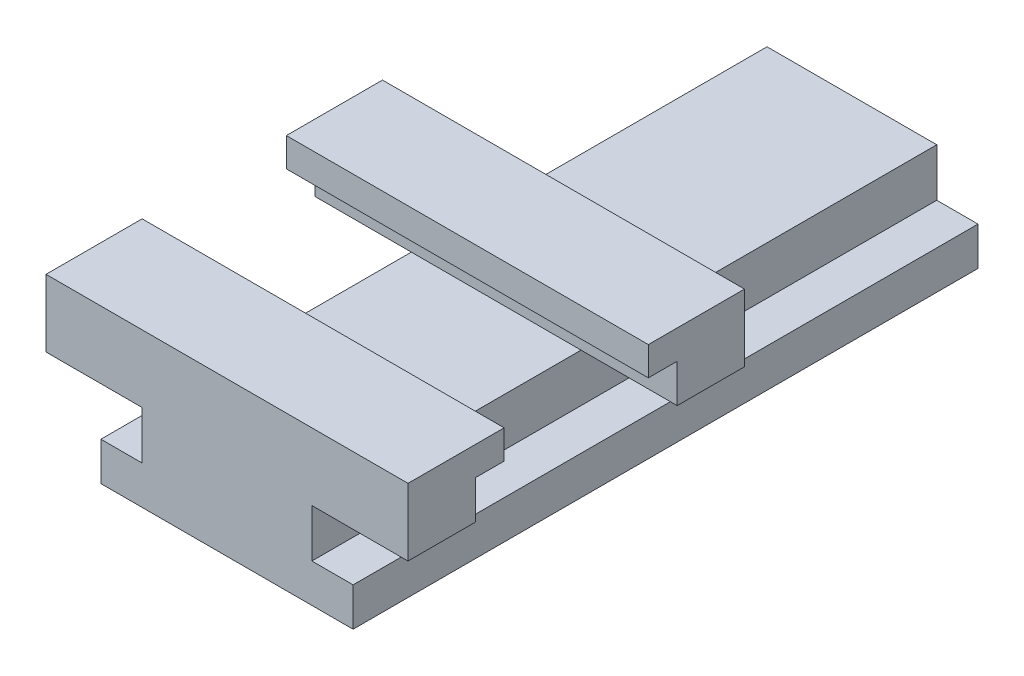
ISO-10303-21;
HEADER;
FILE_DESCRIPTION(('STEP AP214'),'2;1');
FILE_NAME('part.step','',(''),(''),'','','');
FILE_SCHEMA(('AUTOMOTIVE_DESIGN { 1 0 10303 214 1 1 1 1 }'));
ENDSEC;
DATA;
#1=APPLICATION_CONTEXT('core data for automotive mechanical design processes');
#2=APPLICATION_PROTOCOL_DEFINITION('international standard','automotive_design',2000,#1);
#3=PRODUCT_CONTEXT('',#1,'mechanical');
#4=PRODUCT('Part','Part','',(#3));
#5=PRODUCT_RELATED_PRODUCT_CATEGORY('part','',(#4));
#6=PRODUCT_DEFINITION_FORMATION('','',#4);
#7=PRODUCT_DEFINITION_CONTEXT('part definition',#1,'design');
#8=PRODUCT_DEFINITION('design','',#6,#7);
#9=PRODUCT_DEFINITION_SHAPE('','',#8);
#10=(LENGTH_UNIT() NAMED_UNIT(*) SI_UNIT(.MILLI.,.METRE.));
#11=(NAMED_UNIT(*) PLANE_ANGLE_UNIT() SI_UNIT($,.RADIAN.));
#12=(NAMED_UNIT(*) SI_UNIT($,.STERADIAN.) SOLID_ANGLE_UNIT());
#13=UNCERTAINTY_MEASURE_WITH_UNIT(LENGTH_MEASURE(1.E-05),#10,'distance_accuracy_value','');
#14=(GEOMETRIC_REPRESENTATION_CONTEXT(3) GLOBAL_UNCERTAINTY_ASSIGNED_CONTEXT((#13)) GLOBAL_UNIT_ASSIGNED_CONTEXT((#10,
#11,#12)) REPRESENTATION_CONTEXT('',''));
#15=CARTESIAN_POINT('',(0.,0.,0.));
#16=DIRECTION('',(0.,0.,1.));
#17=DIRECTION('',(1.,0.,0.));
#18=AXIS2_PLACEMENT_3D('',#15,#16,#17);
#19=CARTESIAN_POINT('',(0.,0.,0.));
#20=DIRECTION('',(0.,0.,1.));
#21=DIRECTION('',(1.,0.,0.));
#22=AXIS2_PLACEMENT_3D('',#19,#20,#21);
#23=PLANE('',#22);
#24=DIRECTION('',(-1.,0.,0.));
#25=VECTOR('',#24,1.);
#26=CARTESIAN_POINT('',(0.,2.,0.));
#27=LINE('',#26,#25);
#28=CARTESIAN_POINT('',(17.6562351707865,2.,0.));
#29=VERTEX_POINT('',#28);
#30=CARTESIAN_POINT('',(-17.6562351707865,2.,0.));
#31=VERTEX_POINT('',#30);
#32=EDGE_CURVE('E234',#29,#31,#27,.T.);
#33=ORIENTED_EDGE('',*,*,#32,.F.);
#34=DIRECTION('',(0.,-1.,0.));
#35=VECTOR('',#34,1.);
#36=CARTESIAN_POINT('',(17.6562351707865,0.,0.));
#37=LINE('',#36,#35);
#38=CARTESIAN_POINT('',(17.6562351707865,-8.,0.));
#39=VERTEX_POINT('',#38);
#40=EDGE_CURVE('E180',#29,#39,#37,.T.);
#41=ORIENTED_EDGE('',*,*,#40,.T.);
#42=DIRECTION('',(1.,0.,0.));
#43=VECTOR('',#42,1.);
#44=CARTESIAN_POINT('',(0.,-8.,0.));
#45=LINE('',#44,#43);
#46=CARTESIAN_POINT('',(26.23674746176,-8.,0.));
#47=VERTEX_POINT('',#46);
#48=EDGE_CURVE('E176',#39,#47,#45,.T.);
#49=ORIENTED_EDGE('',*,*,#48,.T.);
#50=DIRECTION('',(0.,-1.,0.));
#51=VECTOR('',#50,1.);
#52=CARTESIAN_POINT('',(26.23674746176,0.,0.));
#53=LINE('',#52,#51);
#54=CARTESIAN_POINT('',(26.23674746176,-16.,0.));
#55=VERTEX_POINT('',#54);
#56=EDGE_CURVE('E171',#47,#55,#53,.T.);
#57=ORIENTED_EDGE('',*,*,#56,.T.);
#58=DIRECTION('',(1.,0.,0.));
#59=VECTOR('',#58,1.);
#60=CARTESIAN_POINT('',(0.,-16.,0.));
#61=LINE('',#60,#59);
#62=CARTESIAN_POINT('',(-26.23674746176,-16.,0.));
#63=VERTEX_POINT('',#62);
#64=EDGE_CURVE('E167',#63,#55,#61,.T.);
#65=ORIENTED_EDGE('',*,*,#64,.F.);
#66=DIRECTION('',(0.,-1.,0.));
#67=VECTOR('',#66,1.);
#68=CARTESIAN_POINT('',(-26.23674746176,0.,0.));
#69=LINE('',#68,#67);
#70=CARTESIAN_POINT('',(-26.23674746176,-8.,0.));
#71=VERTEX_POINT('',#70);
#72=EDGE_CURVE('E99',#71,#63,#69,.T.);
#73=ORIENTED_EDGE('',*,*,#72,.F.);
#74=DIRECTION('',(-1.,0.,0.));
#75=VECTOR('',#74,1.);
#76=CARTESIAN_POINT('',(0.,-8.,0.));
#77=LINE('',#76,#75);
#78=CARTESIAN_POINT('',(-17.6562351707865,-8.,0.));
#79=VERTEX_POINT('',#78);
#80=EDGE_CURVE('E186',#79,#71,#77,.T.);
#81=ORIENTED_EDGE('',*,*,#80,.F.);
#82=DIRECTION('',(0.,-1.,0.));
#83=VECTOR('',#82,1.);
#84=CARTESIAN_POINT('',(-17.6562351707865,0.,0.));
#85=LINE('',#84,#83);
#86=EDGE_CURVE('E152',#31,#79,#85,.T.);
#87=ORIENTED_EDGE('',*,*,#86,.F.);
#88=EDGE_LOOP('',(#33,#41,#49,#57,#65,#73,#81,#87));
#89=FACE_BOUND('',#88,.T.);
#90=ADVANCED_FACE('F44',(#89),#23,.F.);
#91=CARTESIAN_POINT('',(0.,2.,130.));
#92=DIRECTION('',(0.,-1.,0.));
#93=DIRECTION('',(0.,0.,-1.));
#94=AXIS2_PLACEMENT_3D('',#91,#92,#93);
#95=PLANE('',#94);
#96=DIRECTION('',(-1.,0.,0.));
#97=VECTOR('',#96,1.);
#98=CARTESIAN_POINT('',(56.3437648292135,2.,116.));
#99=LINE('',#98,#97);
#100=CARTESIAN_POINT('',(37.6562351707865,2.,116.));
#101=VERTEX_POINT('',#100);
#102=CARTESIAN_POINT('',(17.6562351707865,2.,116.));
#103=VERTEX_POINT('',#102);
#104=EDGE_CURVE('E450',#101,#103,#99,.T.);
#105=ORIENTED_EDGE('',*,*,#104,.F.);
#106=DIRECTION('',(0.,0.,-1.));
#107=VECTOR('',#106,1.);
#108=CARTESIAN_POINT('',(37.6562351707865,2.,130.));
#109=LINE('',#108,#107);
#110=CARTESIAN_POINT('',(37.6562351707865,2.,130.));
#111=VERTEX_POINT('',#110);
#112=EDGE_CURVE('E215',#111,#101,#109,.T.);
#113=ORIENTED_EDGE('',*,*,#112,.F.);
#114=DIRECTION('',(-1.,0.,0.));
#115=VECTOR('',#114,1.);
#116=CARTESIAN_POINT('',(0.,2.,130.));
#117=LINE('',#116,#115);
#118=CARTESIAN_POINT('',(17.6562351707865,2.,130.));
#119=VERTEX_POINT('',#118);
#120=EDGE_CURVE('E296',#111,#119,#117,.T.);
#121=ORIENTED_EDGE('',*,*,#120,.T.);
#122=DIRECTION('',(0.,0.,-1.));
#123=VECTOR('',#122,1.);
#124=CARTESIAN_POINT('',(17.6562351707865,2.,130.));
#125=LINE('',#124,#123);
#126=EDGE_CURVE('E220',#119,#103,#125,.T.);
#127=ORIENTED_EDGE('',*,*,#126,.T.);
#128=EDGE_LOOP('',(#105,#113,#121,#127));
#129=FACE_BOUND('',#128,.T.);
#130=ADVANCED_FACE('F473',(#129),#95,.T.);
#131=DIRECTION('',(-1.,0.,0.));
#132=VECTOR('',#131,1.);
#133=CARTESIAN_POINT('',(56.3437648292135,2.,74.));
#134=LINE('',#133,#132);
#135=CARTESIAN_POINT('',(37.6562351707865,2.,74.));
#136=VERTEX_POINT('',#135);
#137=CARTESIAN_POINT('',(17.6562351707865,2.,74.));
#138=VERTEX_POINT('',#137);
#139=EDGE_CURVE('E428',#136,#138,#134,.T.);
#140=ORIENTED_EDGE('',*,*,#139,.T.);
#141=CARTESIAN_POINT('',(17.6562351707865,2.,60.));
#142=VERTEX_POINT('',#141);
#143=EDGE_CURVE('E219',#138,#142,#125,.T.);
#144=ORIENTED_EDGE('',*,*,#143,.T.);
#145=DIRECTION('',(1.,0.,0.));
#146=VECTOR('',#145,1.);
#147=CARTESIAN_POINT('',(0.,2.,60.));
#148=LINE('',#147,#146);
#149=CARTESIAN_POINT('',(37.6562351707865,2.,60.));
#150=VERTEX_POINT('',#149);
#151=EDGE_CURVE('E418',#142,#150,#148,.T.);
#152=ORIENTED_EDGE('',*,*,#151,.T.);
#153=EDGE_CURVE('E214',#136,#150,#109,.T.);
#154=ORIENTED_EDGE('',*,*,#153,.F.);
#155=EDGE_LOOP('',(#140,#144,#152,#154));
#156=FACE_BOUND('',#155,.T.);
#157=ADVANCED_FACE('F514',(#156),#95,.T.);
#158=CARTESIAN_POINT('',(37.6562351707865,0.,130.));
#159=DIRECTION('',(1.,0.,0.));
#160=DIRECTION('',(0.,0.,-1.));
#161=AXIS2_PLACEMENT_3D('',#158,#159,#160);
#162=PLANE('',#161);
#163=DIRECTION('',(0.,0.,1.));
#164=VECTOR('',#163,1.);
#165=CARTESIAN_POINT('',(37.6562351707865,10.,130.));
#166=LINE('',#165,#164);
#167=CARTESIAN_POINT('',(37.6562351707865,10.,110.));
#168=VERTEX_POINT('',#167);
#169=CARTESIAN_POINT('',(37.6562351707865,10.,116.));
#170=VERTEX_POINT('',#169);
#171=EDGE_CURVE('E442',#168,#170,#166,.T.);
#172=ORIENTED_EDGE('',*,*,#171,.F.);
#173=DIRECTION('',(0.,1.,0.));
#174=VECTOR('',#173,1.);
#175=CARTESIAN_POINT('',(37.6562351707865,2.,110.));
#176=LINE('',#175,#174);
#177=CARTESIAN_POINT('',(37.6562351707865,16.,110.));
#178=VERTEX_POINT('',#177);
#179=EDGE_CURVE('E275',#168,#178,#176,.T.);
#180=ORIENTED_EDGE('',*,*,#179,.T.);
#181=DIRECTION('',(0.,0.,-1.));
#182=VECTOR('',#181,1.);
#183=CARTESIAN_POINT('',(37.6562351707865,16.,130.));
#184=LINE('',#183,#182);
#185=CARTESIAN_POINT('',(37.6562351707865,16.,130.));
#186=VERTEX_POINT('',#185);
#187=EDGE_CURVE('E210',#186,#178,#184,.T.);
#188=ORIENTED_EDGE('',*,*,#187,.F.);
#189=DIRECTION('',(0.,-1.,0.));
#190=VECTOR('',#189,1.);
#191=CARTESIAN_POINT('',(37.6562351707865,0.,130.));
#192=LINE('',#191,#190);
#193=EDGE_CURVE('E300',#186,#111,#192,.T.);
#194=ORIENTED_EDGE('',*,*,#193,.T.);
#195=ORIENTED_EDGE('',*,*,#112,.T.);
#196=DIRECTION('',(0.,-1.,0.));
#197=VECTOR('',#196,1.);
#198=CARTESIAN_POINT('',(37.6562351707865,0.,116.));
#199=LINE('',#198,#197);
#200=EDGE_CURVE('E262',#170,#101,#199,.T.);
#201=ORIENTED_EDGE('',*,*,#200,.F.);
#202=EDGE_LOOP('',(#172,#180,#188,#194,#195,#201));
#203=FACE_BOUND('',#202,.T.);
#204=ADVANCED_FACE('F476',(#203),#162,.T.);
#205=DIRECTION('',(0.,1.,0.));
#206=VECTOR('',#205,1.);
#207=CARTESIAN_POINT('',(37.6562351707865,0.,74.));
#208=LINE('',#207,#206);
#209=CARTESIAN_POINT('',(37.6562351707865,10.,74.));
#210=VERTEX_POINT('',#209);
#211=EDGE_CURVE('E419',#136,#210,#208,.T.);
#212=ORIENTED_EDGE('',*,*,#211,.F.);
#213=ORIENTED_EDGE('',*,*,#153,.T.);
#214=DIRECTION('',(0.,1.,0.));
#215=VECTOR('',#214,1.);
#216=CARTESIAN_POINT('',(37.6562351707865,2.,60.));
#217=LINE('',#216,#215);
#218=CARTESIAN_POINT('',(37.6562351707865,16.,60.));
#219=VERTEX_POINT('',#218);
#220=EDGE_CURVE('E407',#150,#219,#217,.T.);
#221=ORIENTED_EDGE('',*,*,#220,.T.);
#222=CARTESIAN_POINT('',(37.6562351707865,16.,80.));
#223=VERTEX_POINT('',#222);
#224=EDGE_CURVE('E209',#223,#219,#184,.T.);
#225=ORIENTED_EDGE('',*,*,#224,.F.);
#226=DIRECTION('',(0.,1.,0.));
#227=VECTOR('',#226,1.);
#228=CARTESIAN_POINT('',(37.6562351707865,2.,80.));
#229=LINE('',#228,#227);
#230=CARTESIAN_POINT('',(37.6562351707865,10.,80.));
#231=VERTEX_POINT('',#230);
#232=EDGE_CURVE('E269',#231,#223,#229,.T.);
#233=ORIENTED_EDGE('',*,*,#232,.F.);
#234=DIRECTION('',(0.,0.,1.));
#235=VECTOR('',#234,1.);
#236=CARTESIAN_POINT('',(37.6562351707865,10.,130.));
#237=LINE('',#236,#235);
#238=EDGE_CURVE('E60',#210,#231,#237,.T.);
#239=ORIENTED_EDGE('',*,*,#238,.F.);
#240=EDGE_LOOP('',(#212,#213,#221,#225,#233,#239));
#241=FACE_BOUND('',#240,.T.);
#242=ADVANCED_FACE('F522',(#241),#162,.T.);
#243=CARTESIAN_POINT('',(0.,16.,130.));
#244=DIRECTION('',(0.,-1.,0.));
#245=DIRECTION('',(0.,0.,-1.));
#246=AXIS2_PLACEMENT_3D('',#243,#244,#245);
#247=PLANE('',#246);
#248=DIRECTION('',(-1.,0.,0.));
#249=VECTOR('',#248,1.);
#250=CARTESIAN_POINT('',(0.,16.,110.));
#251=LINE('',#250,#249);
#252=CARTESIAN_POINT('',(-37.6562351707865,16.,110.));
#253=VERTEX_POINT('',#252);
#254=EDGE_CURVE('E391',#178,#253,#251,.T.);
#255=ORIENTED_EDGE('',*,*,#254,.T.);
#256=DIRECTION('',(0.,0.,-1.));
#257=VECTOR('',#256,1.);
#258=CARTESIAN_POINT('',(-37.6562351707865,16.,130.));
#259=LINE('',#258,#257);
#260=CARTESIAN_POINT('',(-37.6562351707865,16.,130.));
#261=VERTEX_POINT('',#260);
#262=EDGE_CURVE('E205',#261,#253,#259,.T.);
#263=ORIENTED_EDGE('',*,*,#262,.F.);
#264=DIRECTION('',(-1.,0.,0.));
#265=VECTOR('',#264,1.);
#266=CARTESIAN_POINT('',(0.,16.,130.));
#267=LINE('',#266,#265);
#268=EDGE_CURVE('E304',#186,#261,#267,.T.);
#269=ORIENTED_EDGE('',*,*,#268,.F.);
#270=ORIENTED_EDGE('',*,*,#187,.T.);
#271=EDGE_LOOP('',(#255,#263,#269,#270));
#272=FACE_BOUND('',#271,.T.);
#273=ADVANCED_FACE('F394',(#272),#247,.F.);
#274=ORIENTED_EDGE('',*,*,#224,.T.);
#275=DIRECTION('',(1.,0.,0.));
#276=VECTOR('',#275,1.);
#277=CARTESIAN_POINT('',(0.,16.,60.));
#278=LINE('',#277,#276);
#279=CARTESIAN_POINT('',(-37.6562351707865,16.,60.));
#280=VERTEX_POINT('',#279);
#281=EDGE_CURVE('E415',#280,#219,#278,.T.);
#282=ORIENTED_EDGE('',*,*,#281,.F.);
#283=CARTESIAN_POINT('',(-37.6562351707865,16.,80.));
#284=VERTEX_POINT('',#283);
#285=EDGE_CURVE('E204',#284,#280,#259,.T.);
#286=ORIENTED_EDGE('',*,*,#285,.F.);
#287=DIRECTION('',(1.,0.,0.));
#288=VECTOR('',#287,1.);
#289=CARTESIAN_POINT('',(0.,16.,80.));
#290=LINE('',#289,#288);
#291=EDGE_CURVE('E266',#284,#223,#290,.T.);
#292=ORIENTED_EDGE('',*,*,#291,.T.);
#293=EDGE_LOOP('',(#274,#282,#286,#292));
#294=FACE_BOUND('',#293,.T.);
#295=ADVANCED_FACE('F524',(#294),#247,.F.);
#296=CARTESIAN_POINT('',(-37.6562351707865,0.,130.));
#297=DIRECTION('',(1.,0.,0.));
#298=DIRECTION('',(0.,0.,-1.));
#299=AXIS2_PLACEMENT_3D('',#296,#297,#298);
#300=PLANE('',#299);
#301=DIRECTION('',(0.,1.,0.));
#302=VECTOR('',#301,1.);
#303=CARTESIAN_POINT('',(-37.6562351707865,2.,110.));
#304=LINE('',#303,#302);
#305=CARTESIAN_POINT('',(-37.6562351707865,10.,110.));
#306=VERTEX_POINT('',#305);
#307=EDGE_CURVE('E172',#306,#253,#304,.T.);
#308=ORIENTED_EDGE('',*,*,#307,.F.);
#309=DIRECTION('',(0.,0.,-1.));
#310=VECTOR('',#309,1.);
#311=CARTESIAN_POINT('',(-37.6562351707865,10.,116.));
#312=LINE('',#311,#310);
#313=CARTESIAN_POINT('',(-37.6562351707865,10.,116.));
#314=VERTEX_POINT('',#313);
#315=EDGE_CURVE('E449',#314,#306,#312,.T.);
#316=ORIENTED_EDGE('',*,*,#315,.F.);
#317=DIRECTION('',(0.,1.,0.));
#318=VECTOR('',#317,1.);
#319=CARTESIAN_POINT('',(-37.6562351707865,2.,116.));
#320=LINE('',#319,#318);
#321=CARTESIAN_POINT('',(-37.6562351707865,2.,116.));
#322=VERTEX_POINT('',#321);
#323=EDGE_CURVE('E322',#322,#314,#320,.T.);
#324=ORIENTED_EDGE('',*,*,#323,.F.);
#325=DIRECTION('',(0.,0.,-1.));
#326=VECTOR('',#325,1.);
#327=CARTESIAN_POINT('',(-37.6562351707865,2.,130.));
#328=LINE('',#327,#326);
#329=CARTESIAN_POINT('',(-37.6562351707865,2.,130.));
#330=VERTEX_POINT('',#329);
#331=EDGE_CURVE('E200',#330,#322,#328,.T.);
#332=ORIENTED_EDGE('',*,*,#331,.F.);
#333=DIRECTION('',(0.,-1.,0.));
#334=VECTOR('',#333,1.);
#335=CARTESIAN_POINT('',(-37.6562351707865,0.,130.));
#336=LINE('',#335,#334);
#337=EDGE_CURVE('E307',#261,#330,#336,.T.);
#338=ORIENTED_EDGE('',*,*,#337,.F.);
#339=ORIENTED_EDGE('',*,*,#262,.T.);
#340=EDGE_LOOP('',(#308,#316,#324,#332,#338,#339));
#341=FACE_BOUND('',#340,.T.);
#342=ADVANCED_FACE('F318',(#341),#300,.F.);
#343=CARTESIAN_POINT('',(-37.6562351707865,2.,74.));
#344=VERTEX_POINT('',#343);
#345=CARTESIAN_POINT('',(-37.6562351707865,2.,60.));
#346=VERTEX_POINT('',#345);
#347=EDGE_CURVE('E198',#344,#346,#328,.T.);
#348=ORIENTED_EDGE('',*,*,#347,.F.);
#349=DIRECTION('',(0.,-1.,0.));
#350=VECTOR('',#349,1.);
#351=CARTESIAN_POINT('',(-37.6562351707865,10.,74.));
#352=LINE('',#351,#350);
#353=CARTESIAN_POINT('',(-37.6562351707865,10.,74.));
#354=VERTEX_POINT('',#353);
#355=EDGE_CURVE('E260',#354,#344,#352,.T.);
#356=ORIENTED_EDGE('',*,*,#355,.F.);
#357=DIRECTION('',(0.,0.,-1.));
#358=VECTOR('',#357,1.);
#359=CARTESIAN_POINT('',(-37.6562351707865,10.,80.));
#360=LINE('',#359,#358);
#361=CARTESIAN_POINT('',(-37.6562351707865,10.,80.));
#362=VERTEX_POINT('',#361);
#363=EDGE_CURVE('E243',#362,#354,#360,.T.);
#364=ORIENTED_EDGE('',*,*,#363,.F.);
#365=DIRECTION('',(0.,1.,0.));
#366=VECTOR('',#365,1.);
#367=CARTESIAN_POINT('',(-37.6562351707865,2.,80.));
#368=LINE('',#367,#366);
#369=EDGE_CURVE('E257',#362,#284,#368,.T.);
#370=ORIENTED_EDGE('',*,*,#369,.T.);
#371=ORIENTED_EDGE('',*,*,#285,.T.);
#372=DIRECTION('',(0.,1.,0.));
#373=VECTOR('',#372,1.);
#374=CARTESIAN_POINT('',(-37.6562351707865,2.,60.));
#375=LINE('',#374,#373);
#376=EDGE_CURVE('E408',#346,#280,#375,.T.);
#377=ORIENTED_EDGE('',*,*,#376,.F.);
#378=EDGE_LOOP('',(#348,#356,#364,#370,#371,#377));
#379=FACE_BOUND('',#378,.T.);
#380=ADVANCED_FACE('F254',(#379),#300,.F.);
#381=CARTESIAN_POINT('',(0.,2.,130.));
#382=DIRECTION('',(0.,1.,0.));
#383=DIRECTION('',(0.,0.,1.));
#384=AXIS2_PLACEMENT_3D('',#381,#382,#383);
#385=PLANE('',#384);
#386=ORIENTED_EDGE('',*,*,#331,.T.);
#387=CARTESIAN_POINT('',(-17.6562351707865,2.,116.));
#388=VERTEX_POINT('',#387);
#389=EDGE_CURVE('E328',#388,#322,#99,.T.);
#390=ORIENTED_EDGE('',*,*,#389,.F.);
#391=DIRECTION('',(0.,0.,-1.));
#392=VECTOR('',#391,1.);
#393=CARTESIAN_POINT('',(-17.6562351707865,2.,130.));
#394=LINE('',#393,#392);
#395=CARTESIAN_POINT('',(-17.6562351707865,2.,130.));
#396=VERTEX_POINT('',#395);
#397=EDGE_CURVE('E195',#396,#388,#394,.T.);
#398=ORIENTED_EDGE('',*,*,#397,.F.);
#399=DIRECTION('',(1.,0.,0.));
#400=VECTOR('',#399,1.);
#401=CARTESIAN_POINT('',(0.,2.,130.));
#402=LINE('',#401,#400);
#403=EDGE_CURVE('E141',#330,#396,#402,.T.);
#404=ORIENTED_EDGE('',*,*,#403,.F.);
#405=EDGE_LOOP('',(#386,#390,#398,#404));
#406=FACE_BOUND('',#405,.T.);
#407=ADVANCED_FACE('F325',(#406),#385,.F.);
#408=CARTESIAN_POINT('',(-17.6562351707865,2.,74.));
#409=VERTEX_POINT('',#408);
#410=CARTESIAN_POINT('',(-17.6562351707865,2.,60.));
#411=VERTEX_POINT('',#410);
#412=EDGE_CURVE('E156',#409,#411,#394,.T.);
#413=ORIENTED_EDGE('',*,*,#412,.F.);
#414=EDGE_CURVE('E432',#409,#344,#134,.T.);
#415=ORIENTED_EDGE('',*,*,#414,.T.);
#416=ORIENTED_EDGE('',*,*,#347,.T.);
#417=EDGE_CURVE('E411',#346,#411,#148,.T.);
#418=ORIENTED_EDGE('',*,*,#417,.T.);
#419=EDGE_LOOP('',(#413,#415,#416,#418));
#420=FACE_BOUND('',#419,.T.);
#421=ADVANCED_FACE('F526',(#420),#385,.F.);
#422=CARTESIAN_POINT('',(0.,-16.,130.));
#423=DIRECTION('',(0.,1.,0.));
#424=DIRECTION('',(0.,0.,1.));
#425=AXIS2_PLACEMENT_3D('',#422,#423,#424);
#426=PLANE('',#425);
#427=ORIENTED_EDGE('',*,*,#64,.T.);
#428=DIRECTION('',(0.,0.,-1.));
#429=VECTOR('',#428,1.);
#430=CARTESIAN_POINT('',(26.23674746176,-16.,130.));
#431=LINE('',#430,#429);
#432=CARTESIAN_POINT('',(26.23674746176,-16.,130.));
#433=VERTEX_POINT('',#432);
#434=EDGE_CURVE('E231',#433,#55,#431,.T.);
#435=ORIENTED_EDGE('',*,*,#434,.F.);
#436=DIRECTION('',(1.,0.,0.));
#437=VECTOR('',#436,1.);
#438=CARTESIAN_POINT('',(0.,-16.,130.));
#439=LINE('',#438,#437);
#440=CARTESIAN_POINT('',(-26.23674746176,-16.,130.));
#441=VERTEX_POINT('',#440);
#442=EDGE_CURVE('E105',#441,#433,#439,.T.);
#443=ORIENTED_EDGE('',*,*,#442,.F.);
#444=DIRECTION('',(0.,0.,-1.));
#445=VECTOR('',#444,1.);
#446=CARTESIAN_POINT('',(-26.23674746176,-16.,130.));
#447=LINE('',#446,#445);
#448=EDGE_CURVE('E163',#441,#63,#447,.T.);
#449=ORIENTED_EDGE('',*,*,#448,.T.);
#450=EDGE_LOOP('',(#427,#435,#443,#449));
#451=FACE_BOUND('',#450,.T.);
#452=ADVANCED_FACE('F46',(#451),#426,.F.);
#453=CARTESIAN_POINT('',(26.23674746176,0.,130.));
#454=DIRECTION('',(1.,0.,0.));
#455=DIRECTION('',(0.,1.,0.));
#456=AXIS2_PLACEMENT_3D('',#453,#454,#455);
#457=PLANE('',#456);
#458=ORIENTED_EDGE('',*,*,#56,.F.);
#459=DIRECTION('',(0.,0.,-1.));
#460=VECTOR('',#459,1.);
#461=CARTESIAN_POINT('',(26.23674746176,-8.,130.));
#462=LINE('',#461,#460);
#463=CARTESIAN_POINT('',(26.23674746176,-8.,130.));
#464=VERTEX_POINT('',#463);
#465=EDGE_CURVE('E228',#464,#47,#462,.T.);
#466=ORIENTED_EDGE('',*,*,#465,.F.);
#467=DIRECTION('',(0.,-1.,0.));
#468=VECTOR('',#467,1.);
#469=CARTESIAN_POINT('',(26.23674746176,0.,130.));
#470=LINE('',#469,#468);
#471=EDGE_CURVE('E284',#464,#433,#470,.T.);
#472=ORIENTED_EDGE('',*,*,#471,.T.);
#473=ORIENTED_EDGE('',*,*,#434,.T.);
#474=EDGE_LOOP('',(#458,#466,#472,#473));
#475=FACE_BOUND('',#474,.T.);
#476=ADVANCED_FACE('F567',(#475),#457,.T.);
#477=CARTESIAN_POINT('',(0.,-8.,130.));
#478=DIRECTION('',(0.,1.,0.));
#479=DIRECTION('',(0.,0.,1.));
#480=AXIS2_PLACEMENT_3D('',#477,#478,#479);
#481=PLANE('',#480);
#482=ORIENTED_EDGE('',*,*,#48,.F.);
#483=DIRECTION('',(0.,0.,-1.));
#484=VECTOR('',#483,1.);
#485=CARTESIAN_POINT('',(17.6562351707865,-8.,130.));
#486=LINE('',#485,#484);
#487=CARTESIAN_POINT('',(17.6562351707865,-8.,130.));
#488=VERTEX_POINT('',#487);
#489=EDGE_CURVE('E224',#488,#39,#486,.T.);
#490=ORIENTED_EDGE('',*,*,#489,.F.);
#491=DIRECTION('',(1.,0.,0.));
#492=VECTOR('',#491,1.);
#493=CARTESIAN_POINT('',(0.,-8.,130.));
#494=LINE('',#493,#492);
#495=EDGE_CURVE('E288',#488,#464,#494,.T.);
#496=ORIENTED_EDGE('',*,*,#495,.T.);
#497=ORIENTED_EDGE('',*,*,#465,.T.);
#498=EDGE_LOOP('',(#482,#490,#496,#497));
#499=FACE_BOUND('',#498,.T.);
#500=ADVANCED_FACE('F565',(#499),#481,.T.);
#501=CARTESIAN_POINT('',(17.6562351707865,0.,130.));
#502=DIRECTION('',(1.,0.,0.));
#503=DIRECTION('',(0.,0.,-1.));
#504=AXIS2_PLACEMENT_3D('',#501,#502,#503);
#505=PLANE('',#504);
#506=ORIENTED_EDGE('',*,*,#40,.F.);
#507=DIRECTION('',(0.,0.,1.));
#508=VECTOR('',#507,1.);
#509=CARTESIAN_POINT('',(17.6562351707865,2.,130.));
#510=LINE('',#509,#508);
#511=EDGE_CURVE('E396',#29,#142,#510,.T.);
#512=ORIENTED_EDGE('',*,*,#511,.T.);
#513=ORIENTED_EDGE('',*,*,#143,.F.);
#514=EDGE_CURVE('E225',#103,#138,#125,.T.);
#515=ORIENTED_EDGE('',*,*,#514,.F.);
#516=ORIENTED_EDGE('',*,*,#126,.F.);
#517=DIRECTION('',(0.,-1.,0.));
#518=VECTOR('',#517,1.);
#519=CARTESIAN_POINT('',(17.6562351707865,0.,130.));
#520=LINE('',#519,#518);
#521=EDGE_CURVE('E292',#119,#488,#520,.T.);
#522=ORIENTED_EDGE('',*,*,#521,.T.);
#523=ORIENTED_EDGE('',*,*,#489,.T.);
#524=EDGE_LOOP('',(#506,#512,#513,#515,#516,#522,#523));
#525=FACE_BOUND('',#524,.T.);
#526=ADVANCED_FACE('F481',(#525),#505,.T.);
#527=CARTESIAN_POINT('',(-17.6562351707865,0.,130.));
#528=DIRECTION('',(1.,0.,0.));
#529=DIRECTION('',(0.,0.,-1.));
#530=AXIS2_PLACEMENT_3D('',#527,#528,#529);
#531=PLANE('',#530);
#532=ORIENTED_EDGE('',*,*,#86,.T.);
#533=DIRECTION('',(0.,0.,-1.));
#534=VECTOR('',#533,1.);
#535=CARTESIAN_POINT('',(-17.6562351707865,-8.,130.));
#536=LINE('',#535,#534);
#537=CARTESIAN_POINT('',(-17.6562351707865,-8.,130.));
#538=VERTEX_POINT('',#537);
#539=EDGE_CURVE('E148',#538,#79,#536,.T.);
#540=ORIENTED_EDGE('',*,*,#539,.F.);
#541=DIRECTION('',(0.,-1.,0.));
#542=VECTOR('',#541,1.);
#543=CARTESIAN_POINT('',(-17.6562351707865,0.,130.));
#544=LINE('',#543,#542);
#545=EDGE_CURVE('E134',#396,#538,#544,.T.);
#546=ORIENTED_EDGE('',*,*,#545,.F.);
#547=ORIENTED_EDGE('',*,*,#397,.T.);
#548=EDGE_CURVE('E199',#388,#409,#394,.T.);
#549=ORIENTED_EDGE('',*,*,#548,.T.);
#550=ORIENTED_EDGE('',*,*,#412,.T.);
#551=DIRECTION('',(0.,0.,1.));
#552=VECTOR('',#551,1.);
#553=CARTESIAN_POINT('',(-17.6562351707865,2.,130.));
#554=LINE('',#553,#552);
#555=EDGE_CURVE('E401',#31,#411,#554,.T.);
#556=ORIENTED_EDGE('',*,*,#555,.F.);
#557=EDGE_LOOP('',(#532,#540,#546,#547,#549,#550,#556));
#558=FACE_BOUND('',#557,.T.);
#559=ADVANCED_FACE('F149',(#558),#531,.F.);
#560=CARTESIAN_POINT('',(0.,-8.,130.));
#561=DIRECTION('',(0.,-1.,0.));
#562=DIRECTION('',(0.,0.,-1.));
#563=AXIS2_PLACEMENT_3D('',#560,#561,#562);
#564=PLANE('',#563);
#565=ORIENTED_EDGE('',*,*,#80,.T.);
#566=DIRECTION('',(0.,0.,-1.));
#567=VECTOR('',#566,1.);
#568=CARTESIAN_POINT('',(-26.23674746176,-8.,130.));
#569=LINE('',#568,#567);
#570=CARTESIAN_POINT('',(-26.23674746176,-8.,130.));
#571=VERTEX_POINT('',#570);
#572=EDGE_CURVE('E157',#571,#71,#569,.T.);
#573=ORIENTED_EDGE('',*,*,#572,.F.);
#574=DIRECTION('',(-1.,0.,0.));
#575=VECTOR('',#574,1.);
#576=CARTESIAN_POINT('',(0.,-8.,130.));
#577=LINE('',#576,#575);
#578=EDGE_CURVE('E138',#538,#571,#577,.T.);
#579=ORIENTED_EDGE('',*,*,#578,.F.);
#580=ORIENTED_EDGE('',*,*,#539,.T.);
#581=EDGE_LOOP('',(#565,#573,#579,#580));
#582=FACE_BOUND('',#581,.T.);
#583=ADVANCED_FACE('F159',(#582),#564,.F.);
#584=CARTESIAN_POINT('',(-26.23674746176,0.,130.));
#585=DIRECTION('',(1.,0.,0.));
#586=DIRECTION('',(0.,1.,0.));
#587=AXIS2_PLACEMENT_3D('',#584,#585,#586);
#588=PLANE('',#587);
#589=ORIENTED_EDGE('',*,*,#72,.T.);
#590=ORIENTED_EDGE('',*,*,#448,.F.);
#591=DIRECTION('',(0.,-1.,0.));
#592=VECTOR('',#591,1.);
#593=CARTESIAN_POINT('',(-26.23674746176,0.,130.));
#594=LINE('',#593,#592);
#595=EDGE_CURVE('E69',#571,#441,#594,.T.);
#596=ORIENTED_EDGE('',*,*,#595,.F.);
#597=ORIENTED_EDGE('',*,*,#572,.T.);
#598=EDGE_LOOP('',(#589,#590,#596,#597));
#599=FACE_BOUND('',#598,.T.);
#600=ADVANCED_FACE('F549',(#599),#588,.F.);
#601=CARTESIAN_POINT('',(0.,0.,130.));
#602=DIRECTION('',(0.,0.,1.));
#603=DIRECTION('',(1.,0.,0.));
#604=AXIS2_PLACEMENT_3D('',#601,#602,#603);
#605=PLANE('',#604);
#606=ORIENTED_EDGE('',*,*,#442,.T.);
#607=ORIENTED_EDGE('',*,*,#471,.F.);
#608=ORIENTED_EDGE('',*,*,#495,.F.);
#609=ORIENTED_EDGE('',*,*,#521,.F.);
#610=ORIENTED_EDGE('',*,*,#120,.F.);
#611=ORIENTED_EDGE('',*,*,#193,.F.);
#612=ORIENTED_EDGE('',*,*,#268,.T.);
#613=ORIENTED_EDGE('',*,*,#337,.T.);
#614=ORIENTED_EDGE('',*,*,#403,.T.);
#615=ORIENTED_EDGE('',*,*,#545,.T.);
#616=ORIENTED_EDGE('',*,*,#578,.T.);
#617=ORIENTED_EDGE('',*,*,#595,.T.);
#618=EDGE_LOOP('',(#606,#607,#608,#609,#610,#611,#612,#613,#614,#615,#616,#617));
#619=FACE_BOUND('',#618,.T.);
#620=ADVANCED_FACE('F136',(#619),#605,.T.);
#621=CARTESIAN_POINT('',(0.,2.,0.));
#622=DIRECTION('',(0.,1.,0.));
#623=DIRECTION('',(0.,0.,1.));
#624=AXIS2_PLACEMENT_3D('',#621,#622,#623);
#625=PLANE('',#624);
#626=ORIENTED_EDGE('',*,*,#548,.F.);
#627=EDGE_CURVE('E448',#103,#388,#99,.T.);
#628=ORIENTED_EDGE('',*,*,#627,.F.);
#629=ORIENTED_EDGE('',*,*,#514,.T.);
#630=EDGE_CURVE('E436',#138,#409,#134,.T.);
#631=ORIENTED_EDGE('',*,*,#630,.T.);
#632=EDGE_LOOP('',(#626,#628,#629,#631));
#633=FACE_BOUND('',#632,.T.);
#634=ADVANCED_FACE('F486',(#633),#625,.T.);
#635=CARTESIAN_POINT('',(0.,2.,110.));
#636=DIRECTION('',(0.,0.,-1.));
#637=DIRECTION('',(-1.,0.,0.));
#638=AXIS2_PLACEMENT_3D('',#635,#636,#637);
#639=PLANE('',#638);
#640=DIRECTION('',(1.,0.,0.));
#641=VECTOR('',#640,1.);
#642=CARTESIAN_POINT('',(0.,10.,110.));
#643=LINE('',#642,#641);
#644=EDGE_CURVE('E11',#306,#168,#643,.T.);
#645=ORIENTED_EDGE('',*,*,#644,.F.);
#646=ORIENTED_EDGE('',*,*,#307,.T.);
#647=ORIENTED_EDGE('',*,*,#254,.F.);
#648=ORIENTED_EDGE('',*,*,#179,.F.);
#649=EDGE_LOOP('',(#645,#646,#647,#648));
#650=FACE_BOUND('',#649,.T.);
#651=ADVANCED_FACE('F389',(#650),#639,.T.);
#652=CARTESIAN_POINT('',(0.,2.,80.));
#653=DIRECTION('',(0.,0.,1.));
#654=DIRECTION('',(1.,0.,0.));
#655=AXIS2_PLACEMENT_3D('',#652,#653,#654);
#656=PLANE('',#655);
#657=DIRECTION('',(-1.,0.,0.));
#658=VECTOR('',#657,1.);
#659=CARTESIAN_POINT('',(0.,10.,80.));
#660=LINE('',#659,#658);
#661=EDGE_CURVE('E53',#231,#362,#660,.T.);
#662=ORIENTED_EDGE('',*,*,#661,.F.);
#663=ORIENTED_EDGE('',*,*,#232,.T.);
#664=ORIENTED_EDGE('',*,*,#291,.F.);
#665=ORIENTED_EDGE('',*,*,#369,.F.);
#666=EDGE_LOOP('',(#662,#663,#664,#665));
#667=FACE_BOUND('',#666,.T.);
#668=ADVANCED_FACE('F264',(#667),#656,.T.);
#669=CARTESIAN_POINT('',(0.,2.,0.));
#670=DIRECTION('',(0.,1.,0.));
#671=DIRECTION('',(0.,0.,1.));
#672=AXIS2_PLACEMENT_3D('',#669,#670,#671);
#673=PLANE('',#672);
#674=ORIENTED_EDGE('',*,*,#32,.T.);
#675=ORIENTED_EDGE('',*,*,#555,.T.);
#676=EDGE_CURVE('E423',#411,#142,#148,.T.);
#677=ORIENTED_EDGE('',*,*,#676,.T.);
#678=ORIENTED_EDGE('',*,*,#511,.F.);
#679=EDGE_LOOP('',(#674,#675,#677,#678));
#680=FACE_BOUND('',#679,.T.);
#681=ADVANCED_FACE('F497',(#680),#673,.T.);
#682=CARTESIAN_POINT('',(0.,2.,60.));
#683=DIRECTION('',(0.,0.,1.));
#684=DIRECTION('',(1.,0.,0.));
#685=AXIS2_PLACEMENT_3D('',#682,#683,#684);
#686=PLANE('',#685);
#687=ORIENTED_EDGE('',*,*,#281,.T.);
#688=ORIENTED_EDGE('',*,*,#220,.F.);
#689=ORIENTED_EDGE('',*,*,#151,.F.);
#690=ORIENTED_EDGE('',*,*,#676,.F.);
#691=ORIENTED_EDGE('',*,*,#417,.F.);
#692=ORIENTED_EDGE('',*,*,#376,.T.);
#693=EDGE_LOOP('',(#687,#688,#689,#690,#691,#692));
#694=FACE_BOUND('',#693,.T.);
#695=ADVANCED_FACE('F517',(#694),#686,.F.);
#696=CARTESIAN_POINT('',(56.3437648292135,10.,74.));
#697=DIRECTION('',(0.,0.,-1.));
#698=DIRECTION('',(-1.,0.,0.));
#699=AXIS2_PLACEMENT_3D('',#696,#697,#698);
#700=PLANE('',#699);
#701=ORIENTED_EDGE('',*,*,#211,.T.);
#702=DIRECTION('',(-1.,0.,0.));
#703=VECTOR('',#702,1.);
#704=CARTESIAN_POINT('',(56.3437648292135,10.,74.));
#705=LINE('',#704,#703);
#706=EDGE_CURVE('E429',#210,#354,#705,.T.);
#707=ORIENTED_EDGE('',*,*,#706,.T.);
#708=ORIENTED_EDGE('',*,*,#355,.T.);
#709=ORIENTED_EDGE('',*,*,#414,.F.);
#710=ORIENTED_EDGE('',*,*,#630,.F.);
#711=ORIENTED_EDGE('',*,*,#139,.F.);
#712=EDGE_LOOP('',(#701,#707,#708,#709,#710,#711));
#713=FACE_BOUND('',#712,.T.);
#714=ADVANCED_FACE('F528',(#713),#700,.F.);
#715=CARTESIAN_POINT('',(56.3437648292135,10.,80.));
#716=DIRECTION('',(0.,1.,0.));
#717=DIRECTION('',(0.,0.,1.));
#718=AXIS2_PLACEMENT_3D('',#715,#716,#717);
#719=PLANE('',#718);
#720=ORIENTED_EDGE('',*,*,#238,.T.);
#721=ORIENTED_EDGE('',*,*,#661,.T.);
#722=ORIENTED_EDGE('',*,*,#363,.T.);
#723=ORIENTED_EDGE('',*,*,#706,.F.);
#724=EDGE_LOOP('',(#720,#721,#722,#723));
#725=FACE_BOUND('',#724,.T.);
#726=ADVANCED_FACE('F241',(#725),#719,.F.);
#727=CARTESIAN_POINT('',(56.3437648292135,10.,116.));
#728=DIRECTION('',(0.,1.,0.));
#729=DIRECTION('',(0.,0.,1.));
#730=AXIS2_PLACEMENT_3D('',#727,#728,#729);
#731=PLANE('',#730);
#732=ORIENTED_EDGE('',*,*,#171,.T.);
#733=DIRECTION('',(-1.,0.,0.));
#734=VECTOR('',#733,1.);
#735=CARTESIAN_POINT('',(56.3437648292135,10.,116.));
#736=LINE('',#735,#734);
#737=EDGE_CURVE('E445',#170,#314,#736,.T.);
#738=ORIENTED_EDGE('',*,*,#737,.T.);
#739=ORIENTED_EDGE('',*,*,#315,.T.);
#740=ORIENTED_EDGE('',*,*,#644,.T.);
#741=EDGE_LOOP('',(#732,#738,#739,#740));
#742=FACE_BOUND('',#741,.T.);
#743=ADVANCED_FACE('F465',(#742),#731,.F.);
#744=CARTESIAN_POINT('',(56.3437648292135,2.,116.));
#745=DIRECTION('',(0.,0.,1.));
#746=DIRECTION('',(1.,0.,0.));
#747=AXIS2_PLACEMENT_3D('',#744,#745,#746);
#748=PLANE('',#747);
#749=ORIENTED_EDGE('',*,*,#200,.T.);
#750=ORIENTED_EDGE('',*,*,#104,.T.);
#751=ORIENTED_EDGE('',*,*,#627,.T.);
#752=ORIENTED_EDGE('',*,*,#389,.T.);
#753=ORIENTED_EDGE('',*,*,#323,.T.);
#754=ORIENTED_EDGE('',*,*,#737,.F.);
#755=EDGE_LOOP('',(#749,#750,#751,#752,#753,#754));
#756=FACE_BOUND('',#755,.T.);
#757=ADVANCED_FACE('F461',(#756),#748,.F.);
#758=CLOSED_SHELL('',(#90,#130,#157,#204,#242,#273,#295,#342,#380,#407,#421,#452,#476,#500,#526,
#559,#583,#600,#620,#634,#651,#668,#681,#695,#714,#726,#743,#757));
#759=MANIFOLD_SOLID_BREP('B2',#758);
#760=ADVANCED_BREP_SHAPE_REPRESENTATION('',(#18,#759),#14);
#761=SHAPE_DEFINITION_REPRESENTATION(#9,#760);
ENDSEC;
END-ISO-10303-21;
